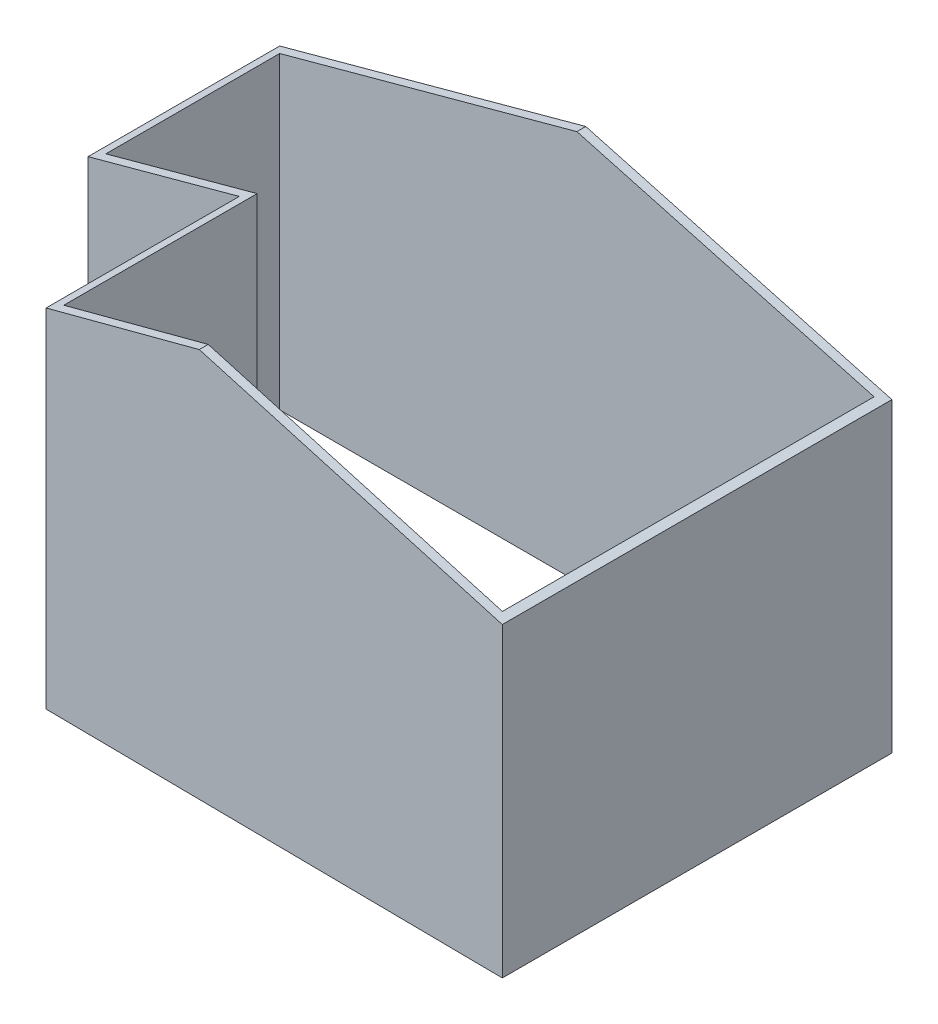
ISO-10303-21;
HEADER;
FILE_DESCRIPTION(('STEP AP214'),'2;1');
FILE_NAME('part.step','',(''),(''),'','','');
FILE_SCHEMA(('AUTOMOTIVE_DESIGN { 1 0 10303 214 1 1 1 1 }'));
ENDSEC;
DATA;
#1=APPLICATION_CONTEXT('core data for automotive mechanical design processes');
#2=APPLICATION_PROTOCOL_DEFINITION('international standard','automotive_design',2000,#1);
#3=PRODUCT_CONTEXT('',#1,'mechanical');
#4=PRODUCT('Part','Part','',(#3));
#5=PRODUCT_RELATED_PRODUCT_CATEGORY('part','',(#4));
#6=PRODUCT_DEFINITION_FORMATION('','',#4);
#7=PRODUCT_DEFINITION_CONTEXT('part definition',#1,'design');
#8=PRODUCT_DEFINITION('design','',#6,#7);
#9=PRODUCT_DEFINITION_SHAPE('','',#8);
#10=(LENGTH_UNIT() NAMED_UNIT(*) SI_UNIT(.MILLI.,.METRE.));
#11=(NAMED_UNIT(*) PLANE_ANGLE_UNIT() SI_UNIT($,.RADIAN.));
#12=(NAMED_UNIT(*) SI_UNIT($,.STERADIAN.) SOLID_ANGLE_UNIT());
#13=UNCERTAINTY_MEASURE_WITH_UNIT(LENGTH_MEASURE(1.E-05),#10,'distance_accuracy_value','');
#14=(GEOMETRIC_REPRESENTATION_CONTEXT(3) GLOBAL_UNCERTAINTY_ASSIGNED_CONTEXT((#13)) GLOBAL_UNIT_ASSIGNED_CONTEXT((#10,
#11,#12)) REPRESENTATION_CONTEXT('',''));
#15=CARTESIAN_POINT('',(0.,0.,0.));
#16=DIRECTION('',(0.,0.,1.));
#17=DIRECTION('',(1.,0.,0.));
#18=AXIS2_PLACEMENT_3D('',#15,#16,#17);
#19=CARTESIAN_POINT('',(-29.2411243545601,88.9,12.8347451502404));
#20=DIRECTION('',(0.,0.,1.));
#21=DIRECTION('',(1.,0.,0.));
#22=AXIS2_PLACEMENT_3D('',#19,#20,#21);
#23=PLANE('',#22);
#24=DIRECTION('',(0.964850510756967,0.262799337693266,0.));
#25=VECTOR('',#24,1.);
#26=CARTESIAN_POINT('',(-26.8011644897338,79.941847584289,12.8347451502404));
#27=LINE('',#26,#25);
#28=CARTESIAN_POINT('',(-63.7618961620269,69.8747380208431,12.8347451502404));
#29=VERTEX_POINT('',#28);
#30=CARTESIAN_POINT('',(-29.2411243545601,79.27726811905,12.8347451502404));
#31=VERTEX_POINT('',#30);
#32=EDGE_CURVE('E301',#29,#31,#27,.T.);
#33=ORIENTED_EDGE('',*,*,#32,.F.);
#34=DIRECTION('',(0.,-1.,0.));
#35=VECTOR('',#34,1.);
#36=CARTESIAN_POINT('',(-63.7618961620269,88.9,12.8347451502404));
#37=LINE('',#36,#35);
#38=CARTESIAN_POINT('',(-63.7618961620269,0.,12.8347451502404));
#39=VERTEX_POINT('',#38);
#40=EDGE_CURVE('E209',#29,#39,#37,.T.);
#41=ORIENTED_EDGE('',*,*,#40,.T.);
#42=DIRECTION('',(-1.,0.,0.));
#43=VECTOR('',#42,1.);
#44=CARTESIAN_POINT('',(-29.2411243545601,0.,12.8347451502404));
#45=LINE('',#44,#43);
#46=CARTESIAN_POINT('',(-29.2411243545601,0.,12.8347451502404));
#47=VERTEX_POINT('',#46);
#48=EDGE_CURVE('E245',#47,#39,#45,.T.);
#49=ORIENTED_EDGE('',*,*,#48,.F.);
#50=DIRECTION('',(0.,-1.,0.));
#51=VECTOR('',#50,1.);
#52=CARTESIAN_POINT('',(-29.2411243545601,88.9,12.8347451502404));
#53=LINE('',#52,#51);
#54=EDGE_CURVE('E216',#31,#47,#53,.T.);
#55=ORIENTED_EDGE('',*,*,#54,.F.);
#56=EDGE_LOOP('',(#33,#41,#49,#55));
#57=FACE_BOUND('',#56,.T.);
#58=ADVANCED_FACE('F75',(#57),#23,.T.);
#59=CARTESIAN_POINT('',(-29.2411243545601,88.9,56.9254295883913));
#60=DIRECTION('',(-1.,0.,0.));
#61=DIRECTION('',(0.,0.,1.));
#62=AXIS2_PLACEMENT_3D('',#59,#60,#61);
#63=PLANE('',#62);
#64=DIRECTION('',(0.,0.,1.));
#65=VECTOR('',#64,1.);
#66=CARTESIAN_POINT('',(-29.2411243545601,79.27726811905,56.9254295883913));
#67=LINE('',#66,#65);
#68=CARTESIAN_POINT('',(-29.2411243545601,79.27726811905,56.9254295883913));
#69=VERTEX_POINT('',#68);
#70=EDGE_CURVE('E304',#31,#69,#67,.T.);
#71=ORIENTED_EDGE('',*,*,#70,.F.);
#72=ORIENTED_EDGE('',*,*,#54,.T.);
#73=DIRECTION('',(0.,0.,-1.));
#74=VECTOR('',#73,1.);
#75=CARTESIAN_POINT('',(-29.2411243545601,0.,56.9254295883913));
#76=LINE('',#75,#74);
#77=CARTESIAN_POINT('',(-29.2411243545601,0.,56.9254295883913));
#78=VERTEX_POINT('',#77);
#79=EDGE_CURVE('E214',#78,#47,#76,.T.);
#80=ORIENTED_EDGE('',*,*,#79,.F.);
#81=DIRECTION('',(0.,-1.,0.));
#82=VECTOR('',#81,1.);
#83=CARTESIAN_POINT('',(-29.2411243545601,88.9,56.9254295883913));
#84=LINE('',#83,#82);
#85=EDGE_CURVE('E207',#69,#78,#84,.T.);
#86=ORIENTED_EDGE('',*,*,#85,.F.);
#87=EDGE_LOOP('',(#71,#72,#80,#86));
#88=FACE_BOUND('',#87,.T.);
#89=ADVANCED_FACE('F368',(#88),#63,.T.);
#90=CARTESIAN_POINT('',(75.945697976427,88.9,58.0084341941158));
#91=DIRECTION('',(-0.0102954646105507,0.,0.999947000299742));
#92=DIRECTION('',(0.999947000299742,0.,0.0102954646105507));
#93=AXIS2_PLACEMENT_3D('',#90,#91,#92);
#94=PLANE('',#93);
#95=DIRECTION('',(0.964802905392864,0.262786371272025,0.00993362064754551));
#96=VECTOR('',#95,1.);
#97=CARTESIAN_POINT('',(71.1215646671579,106.613366208826,57.9587648678942));
#98=LINE('',#97,#96);
#99=CARTESIAN_POINT('',(6.08810383797309,88.9,57.2891796856118));
#100=VERTEX_POINT('',#99);
#101=EDGE_CURVE('E307',#69,#100,#98,.T.);
#102=ORIENTED_EDGE('',*,*,#101,.F.);
#103=ORIENTED_EDGE('',*,*,#85,.T.);
#104=DIRECTION('',(-0.999947000299742,0.,-0.0102954646105507));
#105=VECTOR('',#104,1.);
#106=CARTESIAN_POINT('',(75.945697976427,0.,58.0084341941158));
#107=LINE('',#106,#105);
#108=CARTESIAN_POINT('',(75.945697976427,0.,58.0084341941158));
#109=VERTEX_POINT('',#108);
#110=EDGE_CURVE('E232',#109,#78,#107,.T.);
#111=ORIENTED_EDGE('',*,*,#110,.F.);
#112=DIRECTION('',(0.,-1.,0.));
#113=VECTOR('',#112,1.);
#114=CARTESIAN_POINT('',(75.945697976427,88.9,58.0084341941158));
#115=LINE('',#114,#113);
#116=CARTESIAN_POINT('',(75.945697976427,69.85,58.0084341941158));
#117=VERTEX_POINT('',#116);
#118=EDGE_CURVE('E202',#117,#109,#115,.T.);
#119=ORIENTED_EDGE('',*,*,#118,.F.);
#120=DIRECTION('',(0.964723488126043,-0.263077803858761,0.00993280296654864));
#121=VECTOR('',#120,1.);
#122=CARTESIAN_POINT('',(71.1108587144415,71.168449183324,57.9586546392948));
#123=LINE('',#122,#121);
#124=EDGE_CURVE('E182',#100,#117,#123,.T.);
#125=ORIENTED_EDGE('',*,*,#124,.F.);
#126=EDGE_LOOP('',(#102,#103,#111,#119,#125));
#127=FACE_BOUND('',#126,.T.);
#128=ADVANCED_FACE('F373',(#127),#94,.T.);
#129=CARTESIAN_POINT('',(75.945697976427,88.9,-30.8915658058842));
#130=DIRECTION('',(1.,0.,0.));
#131=DIRECTION('',(0.,0.,-1.));
#132=AXIS2_PLACEMENT_3D('',#129,#130,#131);
#133=PLANE('',#132);
#134=DIRECTION('',(0.,0.,-1.));
#135=VECTOR('',#134,1.);
#136=CARTESIAN_POINT('',(75.945697976427,69.85,71.2164341941158));
#137=LINE('',#136,#135);
#138=CARTESIAN_POINT('',(75.945697976427,69.85,-30.8915658058842));
#139=VERTEX_POINT('',#138);
#140=EDGE_CURVE('E175',#117,#139,#137,.T.);
#141=ORIENTED_EDGE('',*,*,#140,.F.);
#142=ORIENTED_EDGE('',*,*,#118,.T.);
#143=DIRECTION('',(0.,0.,1.));
#144=VECTOR('',#143,1.);
#145=CARTESIAN_POINT('',(75.945697976427,0.,-30.8915658058842));
#146=LINE('',#145,#144);
#147=CARTESIAN_POINT('',(75.945697976427,0.,-30.8915658058842));
#148=VERTEX_POINT('',#147);
#149=EDGE_CURVE('E199',#148,#109,#146,.T.);
#150=ORIENTED_EDGE('',*,*,#149,.F.);
#151=DIRECTION('',(0.,-1.,0.));
#152=VECTOR('',#151,1.);
#153=CARTESIAN_POINT('',(75.945697976427,88.9,-30.8915658058842));
#154=LINE('',#153,#152);
#155=EDGE_CURVE('E192',#139,#148,#154,.T.);
#156=ORIENTED_EDGE('',*,*,#155,.F.);
#157=EDGE_LOOP('',(#141,#142,#150,#156));
#158=FACE_BOUND('',#157,.T.);
#159=ADVANCED_FACE('F197',(#158),#133,.T.);
#160=CARTESIAN_POINT('',(-63.7618961620269,88.9,-30.8915658058842));
#161=DIRECTION('',(0.,0.,-1.));
#162=DIRECTION('',(-1.,0.,0.));
#163=AXIS2_PLACEMENT_3D('',#160,#161,#162);
#164=PLANE('',#163);
#165=DIRECTION('',(-0.964850510756967,-0.262799337693266,0.));
#166=VECTOR('',#165,1.);
#167=CARTESIAN_POINT('',(6.08810383797309,88.9,-30.8915658058842));
#168=LINE('',#167,#166);
#169=CARTESIAN_POINT('',(6.08810383797309,88.9,-30.8915658058842));
#170=VERTEX_POINT('',#169);
#171=CARTESIAN_POINT('',(-63.7618961620269,69.8747380208431,-30.8915658058842));
#172=VERTEX_POINT('',#171);
#173=EDGE_CURVE('E90',#170,#172,#168,.T.);
#174=ORIENTED_EDGE('',*,*,#173,.F.);
#175=DIRECTION('',(-0.964771081734699,0.2630907825228,0.));
#176=VECTOR('',#175,1.);
#177=CARTESIAN_POINT('',(75.945697976427,69.85,-30.8915658058842));
#178=LINE('',#177,#176);
#179=EDGE_CURVE('E179',#139,#170,#178,.T.);
#180=ORIENTED_EDGE('',*,*,#179,.F.);
#181=ORIENTED_EDGE('',*,*,#155,.T.);
#182=DIRECTION('',(1.,0.,0.));
#183=VECTOR('',#182,1.);
#184=CARTESIAN_POINT('',(-63.7618961620269,0.,-30.8915658058842));
#185=LINE('',#184,#183);
#186=CARTESIAN_POINT('',(-63.7618961620269,0.,-30.8915658058842));
#187=VERTEX_POINT('',#186);
#188=EDGE_CURVE('E238',#187,#148,#185,.T.);
#189=ORIENTED_EDGE('',*,*,#188,.F.);
#190=DIRECTION('',(0.,-1.,0.));
#191=VECTOR('',#190,1.);
#192=CARTESIAN_POINT('',(-63.7618961620269,88.9,-30.8915658058842));
#193=LINE('',#192,#191);
#194=EDGE_CURVE('E203',#172,#187,#193,.T.);
#195=ORIENTED_EDGE('',*,*,#194,.F.);
#196=EDGE_LOOP('',(#174,#180,#181,#189,#195));
#197=FACE_BOUND('',#196,.T.);
#198=ADVANCED_FACE('F190',(#197),#164,.T.);
#199=CARTESIAN_POINT('',(-63.7618961620269,88.9,12.8347451502404));
#200=DIRECTION('',(-1.,0.,0.));
#201=DIRECTION('',(0.,0.,1.));
#202=AXIS2_PLACEMENT_3D('',#199,#200,#201);
#203=PLANE('',#202);
#204=DIRECTION('',(0.,0.,-1.));
#205=VECTOR('',#204,1.);
#206=CARTESIAN_POINT('',(-63.7618961620269,69.8747380208431,71.2164341941158));
#207=LINE('',#206,#205);
#208=EDGE_CURVE('E323',#29,#172,#207,.T.);
#209=ORIENTED_EDGE('',*,*,#208,.T.);
#210=ORIENTED_EDGE('',*,*,#194,.T.);
#211=DIRECTION('',(0.,0.,-1.));
#212=VECTOR('',#211,1.);
#213=CARTESIAN_POINT('',(-63.7618961620269,0.,12.8347451502404));
#214=LINE('',#213,#212);
#215=EDGE_CURVE('E241',#39,#187,#214,.T.);
#216=ORIENTED_EDGE('',*,*,#215,.F.);
#217=ORIENTED_EDGE('',*,*,#40,.F.);
#218=EDGE_LOOP('',(#209,#210,#216,#217));
#219=FACE_BOUND('',#218,.T.);
#220=ADVANCED_FACE('F379',(#219),#203,.T.);
#221=CARTESIAN_POINT('',(0.,0.,0.));
#222=DIRECTION('',(0.,-1.,0.));
#223=DIRECTION('',(0.,0.,-1.));
#224=AXIS2_PLACEMENT_3D('',#221,#222,#223);
#225=PLANE('',#224);
#226=DIRECTION('',(-1.,0.,0.));
#227=VECTOR('',#226,1.);
#228=CARTESIAN_POINT('',(0.,0.,10.8027451502404));
#229=LINE('',#228,#227);
#230=CARTESIAN_POINT('',(-27.2091243545601,0.,10.8027451502404));
#231=VERTEX_POINT('',#230);
#232=CARTESIAN_POINT('',(-61.7298961620269,0.,10.8027451502404));
#233=VERTEX_POINT('',#232);
#234=EDGE_CURVE('E287',#231,#233,#229,.T.);
#235=ORIENTED_EDGE('',*,*,#234,.F.);
#236=DIRECTION('',(0.,0.,-1.));
#237=VECTOR('',#236,1.);
#238=CARTESIAN_POINT('',(-27.2091243545601,0.,0.));
#239=LINE('',#238,#237);
#240=CARTESIAN_POINT('',(-27.2091243545601,0.,54.9142433802138));
#241=VERTEX_POINT('',#240);
#242=EDGE_CURVE('E283',#241,#231,#239,.T.);
#243=ORIENTED_EDGE('',*,*,#242,.F.);
#244=DIRECTION('',(-0.999947000299742,0.,-0.0102954646105507));
#245=VECTOR('',#244,1.);
#246=CARTESIAN_POINT('',(-0.568221759460774,0.,55.1885383876279));
#247=LINE('',#246,#245);
#248=CARTESIAN_POINT('',(73.913697976427,0.,55.9554050000952));
#249=VERTEX_POINT('',#248);
#250=EDGE_CURVE('E279',#249,#241,#247,.T.);
#251=ORIENTED_EDGE('',*,*,#250,.F.);
#252=DIRECTION('',(0.,0.,1.));
#253=VECTOR('',#252,1.);
#254=CARTESIAN_POINT('',(73.913697976427,0.,0.));
#255=LINE('',#254,#253);
#256=CARTESIAN_POINT('',(73.913697976427,0.,-28.8595658058842));
#257=VERTEX_POINT('',#256);
#258=EDGE_CURVE('E275',#257,#249,#255,.T.);
#259=ORIENTED_EDGE('',*,*,#258,.F.);
#260=DIRECTION('',(1.,0.,0.));
#261=VECTOR('',#260,1.);
#262=CARTESIAN_POINT('',(0.,0.,-28.8595658058842));
#263=LINE('',#262,#261);
#264=CARTESIAN_POINT('',(-61.7298961620269,0.,-28.8595658058842));
#265=VERTEX_POINT('',#264);
#266=EDGE_CURVE('E271',#265,#257,#263,.T.);
#267=ORIENTED_EDGE('',*,*,#266,.F.);
#268=DIRECTION('',(0.,0.,-1.));
#269=VECTOR('',#268,1.);
#270=CARTESIAN_POINT('',(-61.7298961620269,0.,0.));
#271=LINE('',#270,#269);
#272=EDGE_CURVE('E267',#233,#265,#271,.T.);
#273=ORIENTED_EDGE('',*,*,#272,.F.);
#274=EDGE_LOOP('',(#235,#243,#251,#259,#267,#273));
#275=FACE_BOUND('',#274,.T.);
#276=ORIENTED_EDGE('',*,*,#48,.T.);
#277=ORIENTED_EDGE('',*,*,#215,.T.);
#278=ORIENTED_EDGE('',*,*,#188,.T.);
#279=ORIENTED_EDGE('',*,*,#149,.T.);
#280=ORIENTED_EDGE('',*,*,#110,.T.);
#281=ORIENTED_EDGE('',*,*,#79,.T.);
#282=EDGE_LOOP('',(#276,#277,#278,#279,#280,#281));
#283=FACE_BOUND('',#282,.T.);
#284=ADVANCED_FACE('F352',(#275,#283),#225,.T.);
#285=CARTESIAN_POINT('',(0.,88.9,10.8027451502404));
#286=DIRECTION('',(0.,0.,1.));
#287=DIRECTION('',(1.,0.,0.));
#288=AXIS2_PLACEMENT_3D('',#285,#286,#287);
#289=PLANE('',#288);
#290=DIRECTION('',(0.,-1.,0.));
#291=VECTOR('',#290,1.);
#292=CARTESIAN_POINT('',(-61.7298961620269,88.9,10.8027451502404));
#293=LINE('',#292,#291);
#294=CARTESIAN_POINT('',(-61.7298961620269,70.4282001875095,10.8027451502404));
#295=VERTEX_POINT('',#294);
#296=EDGE_CURVE('E264',#295,#233,#293,.T.);
#297=ORIENTED_EDGE('',*,*,#296,.F.);
#298=DIRECTION('',(0.964850510756967,0.262799337693266,0.));
#299=VECTOR('',#298,1.);
#300=CARTESIAN_POINT('',(0.420465710051627,87.3562877568108,10.8027451502404));
#301=LINE('',#300,#299);
#302=CARTESIAN_POINT('',(-27.2091243545601,79.8307302857163,10.8027451502404));
#303=VERTEX_POINT('',#302);
#304=EDGE_CURVE('E97',#295,#303,#301,.T.);
#305=ORIENTED_EDGE('',*,*,#304,.T.);
#306=DIRECTION('',(0.,-1.,0.));
#307=VECTOR('',#306,1.);
#308=CARTESIAN_POINT('',(-27.2091243545601,88.9,10.8027451502404));
#309=LINE('',#308,#307);
#310=EDGE_CURVE('E249',#303,#231,#309,.T.);
#311=ORIENTED_EDGE('',*,*,#310,.T.);
#312=ORIENTED_EDGE('',*,*,#234,.T.);
#313=EDGE_LOOP('',(#297,#305,#311,#312));
#314=FACE_BOUND('',#313,.T.);
#315=ADVANCED_FACE('F346',(#314),#289,.F.);
#316=CARTESIAN_POINT('',(-27.2091243545601,88.9,0.));
#317=DIRECTION('',(-1.,0.,0.));
#318=DIRECTION('',(0.,0.,1.));
#319=AXIS2_PLACEMENT_3D('',#316,#317,#318);
#320=PLANE('',#319);
#321=ORIENTED_EDGE('',*,*,#310,.F.);
#322=DIRECTION('',(0.,0.,1.));
#323=VECTOR('',#322,1.);
#324=CARTESIAN_POINT('',(-27.2091243545601,79.8307302857163,0.));
#325=LINE('',#324,#323);
#326=CARTESIAN_POINT('',(-27.2091243545601,79.8307302857163,54.9142433802138));
#327=VERTEX_POINT('',#326);
#328=EDGE_CURVE('E314',#303,#327,#325,.T.);
#329=ORIENTED_EDGE('',*,*,#328,.T.);
#330=DIRECTION('',(0.,-1.,0.));
#331=VECTOR('',#330,1.);
#332=CARTESIAN_POINT('',(-27.2091243545601,88.9,54.9142433802138));
#333=LINE('',#332,#331);
#334=EDGE_CURVE('E252',#327,#241,#333,.T.);
#335=ORIENTED_EDGE('',*,*,#334,.T.);
#336=ORIENTED_EDGE('',*,*,#242,.T.);
#337=EDGE_LOOP('',(#321,#329,#335,#336));
#338=FACE_BOUND('',#337,.T.);
#339=ADVANCED_FACE('F343',(#338),#320,.F.);
#340=CARTESIAN_POINT('',(-0.568221759460774,88.9,55.1885383876279));
#341=DIRECTION('',(-0.0102954646105507,0.,0.999947000299742));
#342=DIRECTION('',(0.999947000299742,0.,0.0102954646105507));
#343=AXIS2_PLACEMENT_3D('',#340,#341,#342);
#344=PLANE('',#343);
#345=ORIENTED_EDGE('',*,*,#334,.F.);
#346=DIRECTION('',(0.964802905392864,0.262786371272025,0.00993362064754553));
#347=VECTOR('',#346,1.);
#348=CARTESIAN_POINT('',(-0.108558033162398,87.2121959127472,55.1932710900866));
#349=LINE('',#348,#347);
#350=CARTESIAN_POINT('',(6.08810383797309,88.9,55.2570719845127));
#351=VERTEX_POINT('',#350);
#352=EDGE_CURVE('E310',#327,#351,#349,.T.);
#353=ORIENTED_EDGE('',*,*,#352,.T.);
#354=DIRECTION('',(0.964723488126043,-0.263077803858761,0.00993280296654865));
#355=VECTOR('',#354,1.);
#356=CARTESIAN_POINT('',(-0.107537924926641,90.589536793227,55.1932815931315));
#357=LINE('',#356,#355);
#358=CARTESIAN_POINT('',(73.913697976427,70.4041215737158,55.9554050000952));
#359=VERTEX_POINT('',#358);
#360=EDGE_CURVE('E293',#351,#359,#357,.T.);
#361=ORIENTED_EDGE('',*,*,#360,.T.);
#362=DIRECTION('',(0.,-1.,0.));
#363=VECTOR('',#362,1.);
#364=CARTESIAN_POINT('',(73.913697976427,88.9,55.9554050000952));
#365=LINE('',#364,#363);
#366=EDGE_CURVE('E255',#359,#249,#365,.T.);
#367=ORIENTED_EDGE('',*,*,#366,.T.);
#368=ORIENTED_EDGE('',*,*,#250,.T.);
#369=EDGE_LOOP('',(#345,#353,#361,#367,#368));
#370=FACE_BOUND('',#369,.T.);
#371=ADVANCED_FACE('F337',(#370),#344,.F.);
#372=CARTESIAN_POINT('',(73.913697976427,88.9,0.));
#373=DIRECTION('',(1.,0.,0.));
#374=DIRECTION('',(0.,0.,-1.));
#375=AXIS2_PLACEMENT_3D('',#372,#373,#374);
#376=PLANE('',#375);
#377=ORIENTED_EDGE('',*,*,#366,.F.);
#378=DIRECTION('',(0.,0.,-1.));
#379=VECTOR('',#378,1.);
#380=CARTESIAN_POINT('',(73.913697976427,70.4041215737158,0.));
#381=LINE('',#380,#379);
#382=CARTESIAN_POINT('',(73.913697976427,70.4041215737158,-28.8595658058842));
#383=VERTEX_POINT('',#382);
#384=EDGE_CURVE('E297',#359,#383,#381,.T.);
#385=ORIENTED_EDGE('',*,*,#384,.T.);
#386=DIRECTION('',(0.,-1.,0.));
#387=VECTOR('',#386,1.);
#388=CARTESIAN_POINT('',(73.913697976427,88.9,-28.8595658058842));
#389=LINE('',#388,#387);
#390=EDGE_CURVE('E258',#383,#257,#389,.T.);
#391=ORIENTED_EDGE('',*,*,#390,.T.);
#392=ORIENTED_EDGE('',*,*,#258,.T.);
#393=EDGE_LOOP('',(#377,#385,#391,#392));
#394=FACE_BOUND('',#393,.T.);
#395=ADVANCED_FACE('F358',(#394),#376,.F.);
#396=CARTESIAN_POINT('',(0.,88.9,-28.8595658058842));
#397=DIRECTION('',(0.,0.,-1.));
#398=DIRECTION('',(-1.,0.,0.));
#399=AXIS2_PLACEMENT_3D('',#396,#397,#398);
#400=PLANE('',#399);
#401=DIRECTION('',(-0.964771081734699,0.2630907825228,0.));
#402=VECTOR('',#401,1.);
#403=CARTESIAN_POINT('',(0.421398821285467,90.4452969988337,-28.8595658058842));
#404=LINE('',#403,#402);
#405=CARTESIAN_POINT('',(6.08810383797309,88.9,-28.8595658058842));
#406=VERTEX_POINT('',#405);
#407=EDGE_CURVE('E12',#383,#406,#404,.T.);
#408=ORIENTED_EDGE('',*,*,#407,.T.);
#409=DIRECTION('',(-0.964850510756967,-0.262799337693266,0.));
#410=VECTOR('',#409,1.);
#411=CARTESIAN_POINT('',(0.420465710051626,87.3562877568108,-28.8595658058842));
#412=LINE('',#411,#410);
#413=CARTESIAN_POINT('',(-61.7298961620269,70.4282001875095,-28.8595658058842));
#414=VERTEX_POINT('',#413);
#415=EDGE_CURVE('E320',#406,#414,#412,.T.);
#416=ORIENTED_EDGE('',*,*,#415,.T.);
#417=DIRECTION('',(0.,-1.,0.));
#418=VECTOR('',#417,1.);
#419=CARTESIAN_POINT('',(-61.7298961620269,88.9,-28.8595658058842));
#420=LINE('',#419,#418);
#421=EDGE_CURVE('E261',#414,#265,#420,.T.);
#422=ORIENTED_EDGE('',*,*,#421,.T.);
#423=ORIENTED_EDGE('',*,*,#266,.T.);
#424=ORIENTED_EDGE('',*,*,#390,.F.);
#425=EDGE_LOOP('',(#408,#416,#422,#423,#424));
#426=FACE_BOUND('',#425,.T.);
#427=ADVANCED_FACE('F356',(#426),#400,.F.);
#428=CARTESIAN_POINT('',(-61.7298961620269,88.9,0.));
#429=DIRECTION('',(-1.,0.,0.));
#430=DIRECTION('',(0.,0.,1.));
#431=AXIS2_PLACEMENT_3D('',#428,#429,#430);
#432=PLANE('',#431);
#433=ORIENTED_EDGE('',*,*,#421,.F.);
#434=DIRECTION('',(0.,0.,1.));
#435=VECTOR('',#434,1.);
#436=CARTESIAN_POINT('',(-61.7298961620269,70.4282001875095,0.));
#437=LINE('',#436,#435);
#438=EDGE_CURVE('E83',#414,#295,#437,.T.);
#439=ORIENTED_EDGE('',*,*,#438,.T.);
#440=ORIENTED_EDGE('',*,*,#296,.T.);
#441=ORIENTED_EDGE('',*,*,#272,.T.);
#442=EDGE_LOOP('',(#433,#439,#440,#441));
#443=FACE_BOUND('',#442,.T.);
#444=ADVANCED_FACE('F348',(#443),#432,.F.);
#445=CARTESIAN_POINT('',(75.945697976427,69.85,71.2164341941158));
#446=DIRECTION('',(-0.2630907825228,-0.964771081734699,0.));
#447=DIRECTION('',(0.964771081734699,-0.2630907825228,0.));
#448=AXIS2_PLACEMENT_3D('',#445,#446,#447);
#449=PLANE('',#448);
#450=ORIENTED_EDGE('',*,*,#124,.T.);
#451=ORIENTED_EDGE('',*,*,#140,.T.);
#452=ORIENTED_EDGE('',*,*,#179,.T.);
#453=DIRECTION('',(0.,0.,-1.));
#454=VECTOR('',#453,1.);
#455=CARTESIAN_POINT('',(6.08810383797309,88.9,71.2164341941158));
#456=LINE('',#455,#454);
#457=EDGE_CURVE('E187',#406,#170,#456,.T.);
#458=ORIENTED_EDGE('',*,*,#457,.F.);
#459=ORIENTED_EDGE('',*,*,#407,.F.);
#460=ORIENTED_EDGE('',*,*,#384,.F.);
#461=ORIENTED_EDGE('',*,*,#360,.F.);
#462=EDGE_CURVE('E327',#100,#351,#456,.T.);
#463=ORIENTED_EDGE('',*,*,#462,.F.);
#464=EDGE_LOOP('',(#450,#451,#452,#458,#459,#460,#461,#463));
#465=FACE_BOUND('',#464,.T.);
#466=ADVANCED_FACE('F177',(#465),#449,.F.);
#467=CARTESIAN_POINT('',(6.08810383797309,88.9,71.2164341941158));
#468=DIRECTION('',(0.262799337693266,-0.964850510756967,0.));
#469=DIRECTION('',(0.964850510756967,0.262799337693266,0.));
#470=AXIS2_PLACEMENT_3D('',#467,#468,#469);
#471=PLANE('',#470);
#472=ORIENTED_EDGE('',*,*,#32,.T.);
#473=ORIENTED_EDGE('',*,*,#70,.T.);
#474=ORIENTED_EDGE('',*,*,#101,.T.);
#475=ORIENTED_EDGE('',*,*,#462,.T.);
#476=ORIENTED_EDGE('',*,*,#352,.F.);
#477=ORIENTED_EDGE('',*,*,#328,.F.);
#478=ORIENTED_EDGE('',*,*,#304,.F.);
#479=ORIENTED_EDGE('',*,*,#438,.F.);
#480=ORIENTED_EDGE('',*,*,#415,.F.);
#481=ORIENTED_EDGE('',*,*,#457,.T.);
#482=ORIENTED_EDGE('',*,*,#173,.T.);
#483=ORIENTED_EDGE('',*,*,#208,.F.);
#484=EDGE_LOOP('',(#472,#473,#474,#475,#476,#477,#478,#479,#480,#481,#482,#483));
#485=FACE_BOUND('',#484,.T.);
#486=ADVANCED_FACE('F333',(#485),#471,.F.);
#487=CLOSED_SHELL('',(#58,#89,#128,#159,#198,#220,#284,#315,#339,#371,#395,#427,#444,#466,#486));
#488=MANIFOLD_SOLID_BREP('B2',#487);
#489=ADVANCED_BREP_SHAPE_REPRESENTATION('',(#18,#488),#14);
#490=SHAPE_DEFINITION_REPRESENTATION(#9,#489);
ENDSEC;
END-ISO-10303-21;
